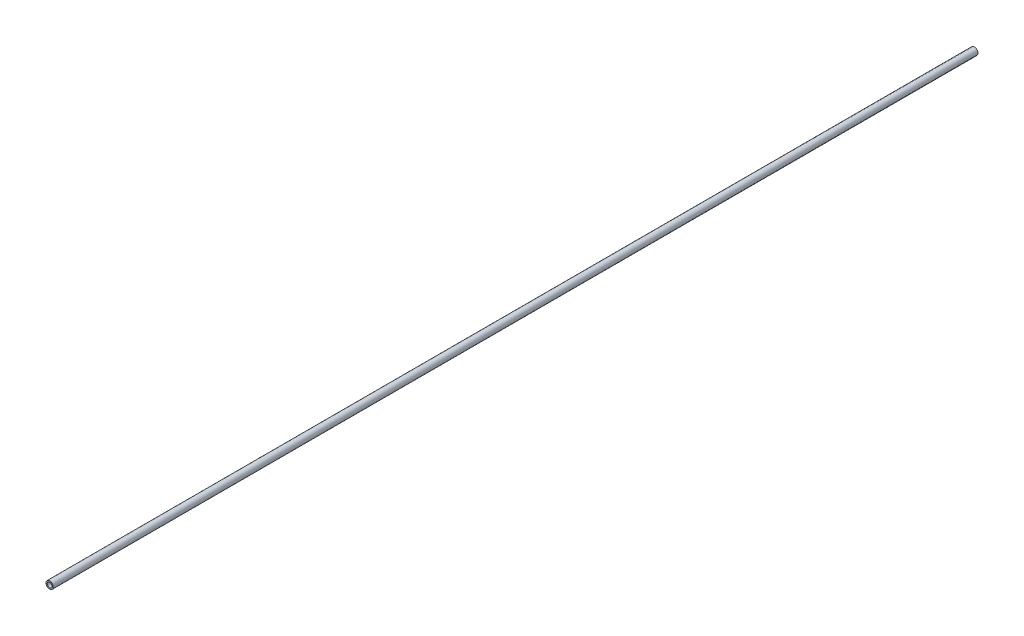
ISO-10303-21;
HEADER;
FILE_DESCRIPTION(('STEP AP214'),'2;1');
FILE_NAME('part.step','',(''),(''),'','','');
FILE_SCHEMA(('AUTOMOTIVE_DESIGN { 1 0 10303 214 1 1 1 1 }'));
ENDSEC;
DATA;
#1=APPLICATION_CONTEXT('core data for automotive mechanical design processes');
#2=APPLICATION_PROTOCOL_DEFINITION('international standard','automotive_design',2000,#1);
#3=PRODUCT_CONTEXT('',#1,'mechanical');
#4=PRODUCT('Part','Part','',(#3));
#5=PRODUCT_RELATED_PRODUCT_CATEGORY('part','',(#4));
#6=PRODUCT_DEFINITION_FORMATION('','',#4);
#7=PRODUCT_DEFINITION_CONTEXT('part definition',#1,'design');
#8=PRODUCT_DEFINITION('design','',#6,#7);
#9=PRODUCT_DEFINITION_SHAPE('','',#8);
#10=(LENGTH_UNIT() NAMED_UNIT(*) SI_UNIT(.MILLI.,.METRE.));
#11=(NAMED_UNIT(*) PLANE_ANGLE_UNIT() SI_UNIT($,.RADIAN.));
#12=(NAMED_UNIT(*) SI_UNIT($,.STERADIAN.) SOLID_ANGLE_UNIT());
#13=UNCERTAINTY_MEASURE_WITH_UNIT(LENGTH_MEASURE(1.E-05),#10,'distance_accuracy_value','');
#14=(GEOMETRIC_REPRESENTATION_CONTEXT(3) GLOBAL_UNCERTAINTY_ASSIGNED_CONTEXT((#13)) GLOBAL_UNIT_ASSIGNED_CONTEXT((#10,
#11,#12)) REPRESENTATION_CONTEXT('',''));
#15=CARTESIAN_POINT('',(0.,0.,0.));
#16=DIRECTION('',(0.,0.,1.));
#17=DIRECTION('',(1.,0.,0.));
#18=AXIS2_PLACEMENT_3D('',#15,#16,#17);
#19=CARTESIAN_POINT('',(0.,0.,1219.2));
#20=DIRECTION('',(0.,0.,1.));
#21=DIRECTION('',(1.,0.,0.));
#22=AXIS2_PLACEMENT_3D('',#19,#20,#21);
#23=PLANE('',#22);
#24=CARTESIAN_POINT('',(0.,0.,1219.2));
#25=DIRECTION('',(0.,0.,1.));
#26=DIRECTION('',(1.,0.,0.));
#27=AXIS2_PLACEMENT_3D('',#24,#25,#26);
#28=CIRCLE('',#27,4.7625);
#29=CARTESIAN_POINT('',(-4.7625,0.,1219.2));
#30=VERTEX_POINT('',#29);
#31=EDGE_CURVE('E10',#30,#30,#28,.T.);
#32=ORIENTED_EDGE('',*,*,#31,.T.);
#33=EDGE_LOOP('',(#32));
#34=FACE_BOUND('',#33,.T.);
#35=CARTESIAN_POINT('',(0.,0.,1219.2));
#36=DIRECTION('',(0.,0.,1.));
#37=DIRECTION('',(1.,0.,0.));
#38=AXIS2_PLACEMENT_3D('',#35,#36,#37);
#39=CIRCLE('',#38,3.175);
#40=CARTESIAN_POINT('',(-3.175,0.,1219.2));
#41=VERTEX_POINT('',#40);
#42=EDGE_CURVE('E48',#41,#41,#39,.T.);
#43=ORIENTED_EDGE('',*,*,#42,.F.);
#44=EDGE_LOOP('',(#43));
#45=FACE_BOUND('',#44,.T.);
#46=ADVANCED_FACE('F37',(#34,#45),#23,.T.);
#47=CARTESIAN_POINT('',(0.,0.,0.));
#48=DIRECTION('',(0.,0.,1.));
#49=DIRECTION('',(1.,0.,0.));
#50=AXIS2_PLACEMENT_3D('',#47,#48,#49);
#51=PLANE('',#50);
#52=CARTESIAN_POINT('',(0.,0.,0.));
#53=DIRECTION('',(0.,0.,1.));
#54=DIRECTION('',(1.,0.,0.));
#55=AXIS2_PLACEMENT_3D('',#52,#53,#54);
#56=CIRCLE('',#55,4.7625);
#57=CARTESIAN_POINT('',(-4.7625,0.,0.));
#58=VERTEX_POINT('',#57);
#59=EDGE_CURVE('E41',#58,#58,#56,.T.);
#60=ORIENTED_EDGE('',*,*,#59,.F.);
#61=EDGE_LOOP('',(#60));
#62=FACE_BOUND('',#61,.T.);
#63=CARTESIAN_POINT('',(0.,0.,0.));
#64=DIRECTION('',(0.,0.,1.));
#65=DIRECTION('',(1.,0.,0.));
#66=AXIS2_PLACEMENT_3D('',#63,#64,#65);
#67=CIRCLE('',#66,3.175);
#68=CARTESIAN_POINT('',(-3.175,0.,0.));
#69=VERTEX_POINT('',#68);
#70=EDGE_CURVE('E50',#69,#69,#67,.T.);
#71=ORIENTED_EDGE('',*,*,#70,.T.);
#72=EDGE_LOOP('',(#71));
#73=FACE_BOUND('',#72,.T.);
#74=ADVANCED_FACE('F60',(#62,#73),#51,.F.);
#75=CARTESIAN_POINT('',(0.,0.,1219.2));
#76=DIRECTION('',(0.,0.,-1.));
#77=DIRECTION('',(-1.,0.,0.));
#78=AXIS2_PLACEMENT_3D('',#75,#76,#77);
#79=CYLINDRICAL_SURFACE('',#78,4.7625);
#80=CARTESIAN_POINT('',(-4.7625,0.,1219.2));
#81=CARTESIAN_POINT('',(-4.7625,0.,1206.5));
#82=CARTESIAN_POINT('',(-4.7625,0.,1193.8));
#83=CARTESIAN_POINT('',(-4.7625,0.,1168.4));
#84=CARTESIAN_POINT('',(-4.7625,0.,1155.7));
#85=CARTESIAN_POINT('',(-4.7625,0.,1130.3));
#86=CARTESIAN_POINT('',(-4.7625,0.,1117.6));
#87=CARTESIAN_POINT('',(-4.7625,0.,1092.2));
#88=CARTESIAN_POINT('',(-4.7625,0.,1079.5));
#89=CARTESIAN_POINT('',(-4.7625,0.,1054.1));
#90=CARTESIAN_POINT('',(-4.7625,0.,1041.4));
#91=CARTESIAN_POINT('',(-4.7625,0.,1016.));
#92=CARTESIAN_POINT('',(-4.7625,0.,1003.3));
#93=CARTESIAN_POINT('',(-4.7625,0.,977.9));
#94=CARTESIAN_POINT('',(-4.7625,0.,965.2));
#95=CARTESIAN_POINT('',(-4.7625,0.,939.8));
#96=CARTESIAN_POINT('',(-4.7625,0.,927.1));
#97=CARTESIAN_POINT('',(-4.7625,0.,901.7));
#98=CARTESIAN_POINT('',(-4.7625,0.,889.));
#99=CARTESIAN_POINT('',(-4.7625,0.,863.6));
#100=CARTESIAN_POINT('',(-4.7625,0.,850.9));
#101=CARTESIAN_POINT('',(-4.7625,0.,825.5));
#102=CARTESIAN_POINT('',(-4.7625,0.,812.8));
#103=CARTESIAN_POINT('',(-4.7625,0.,787.4));
#104=CARTESIAN_POINT('',(-4.7625,0.,774.7));
#105=CARTESIAN_POINT('',(-4.7625,0.,749.3));
#106=CARTESIAN_POINT('',(-4.7625,0.,736.6));
#107=CARTESIAN_POINT('',(-4.7625,0.,711.2));
#108=CARTESIAN_POINT('',(-4.7625,0.,698.5));
#109=CARTESIAN_POINT('',(-4.7625,0.,673.1));
#110=CARTESIAN_POINT('',(-4.7625,0.,660.4));
#111=CARTESIAN_POINT('',(-4.7625,0.,635.));
#112=CARTESIAN_POINT('',(-4.7625,0.,622.3));
#113=CARTESIAN_POINT('',(-4.7625,0.,596.9));
#114=CARTESIAN_POINT('',(-4.7625,0.,584.2));
#115=CARTESIAN_POINT('',(-4.7625,0.,558.8));
#116=CARTESIAN_POINT('',(-4.7625,0.,546.1));
#117=CARTESIAN_POINT('',(-4.7625,0.,520.7));
#118=CARTESIAN_POINT('',(-4.7625,0.,508.));
#119=CARTESIAN_POINT('',(-4.7625,0.,482.6));
#120=CARTESIAN_POINT('',(-4.7625,0.,469.9));
#121=CARTESIAN_POINT('',(-4.7625,0.,444.5));
#122=CARTESIAN_POINT('',(-4.7625,0.,431.8));
#123=CARTESIAN_POINT('',(-4.7625,0.,406.4));
#124=CARTESIAN_POINT('',(-4.7625,0.,393.7));
#125=CARTESIAN_POINT('',(-4.7625,0.,368.3));
#126=CARTESIAN_POINT('',(-4.7625,0.,355.6));
#127=CARTESIAN_POINT('',(-4.7625,0.,330.2));
#128=CARTESIAN_POINT('',(-4.7625,0.,317.5));
#129=CARTESIAN_POINT('',(-4.7625,0.,292.1));
#130=CARTESIAN_POINT('',(-4.7625,0.,279.4));
#131=CARTESIAN_POINT('',(-4.7625,0.,254.));
#132=CARTESIAN_POINT('',(-4.7625,0.,241.3));
#133=CARTESIAN_POINT('',(-4.7625,0.,215.9));
#134=CARTESIAN_POINT('',(-4.7625,0.,203.2));
#135=CARTESIAN_POINT('',(-4.7625,0.,177.8));
#136=CARTESIAN_POINT('',(-4.7625,0.,165.1));
#137=CARTESIAN_POINT('',(-4.7625,0.,139.7));
#138=CARTESIAN_POINT('',(-4.7625,0.,127.));
#139=CARTESIAN_POINT('',(-4.7625,0.,101.6));
#140=CARTESIAN_POINT('',(-4.7625,0.,88.9));
#141=CARTESIAN_POINT('',(-4.7625,0.,63.5));
#142=CARTESIAN_POINT('',(-4.7625,0.,50.8));
#143=CARTESIAN_POINT('',(-4.7625,0.,25.4));
#144=CARTESIAN_POINT('',(-4.7625,0.,12.7));
#145=CARTESIAN_POINT('',(-4.7625,0.,0.));
#146=B_SPLINE_CURVE_WITH_KNOTS('',3,(#80,#81,#82,#83,#84,#85,#86,#87,#88,#89,#90,#91,#92,#93,
#94,#95,#96,#97,#98,#99,#100,#101,#102,#103,#104,#105,#106,#107,#108,#109,#110,#111,#112,#113,
#114,#115,#116,#117,#118,#119,#120,#121,#122,#123,#124,#125,#126,#127,#128,#129,#130,#131,#132,
#133,#134,#135,#136,#137,#138,#139,#140,#141,#142,#143,#144,#145),.UNSPECIFIED.,.F.,.F.,(4,2,2,
2,2,2,2,2,2,2,2,2,2,2,2,2,2,2,2,2,2,2,2,2,2,2,2,2,2,2,2,2,4),(0.,38.1,76.2,114.3,152.4,190.5,
228.6,266.7,304.8,342.9,381.,419.1,457.2,495.3,533.4,571.5,609.6,647.7,685.8,723.9,762.,800.1,
838.2,876.3,914.4,952.5,990.6,1028.7,1066.8,1104.9,1143.,1181.1,1219.2),.UNSPECIFIED.);
#147=EDGE_CURVE('BSEAM39',#30,#58,#146,.T.);
#148=ORIENTED_EDGE('',*,*,#31,.F.);
#149=ORIENTED_EDGE('',*,*,#59,.T.);
#150=ORIENTED_EDGE('',*,*,#147,.T.);
#151=ORIENTED_EDGE('',*,*,#147,.F.);
#152=EDGE_LOOP('',(#148,#150,#149,#151));
#153=FACE_BOUND('',#152,.T.);
#154=ADVANCED_FACE('F39',(#153),#79,.T.);
#155=CARTESIAN_POINT('',(0.,0.,1219.2));
#156=DIRECTION('',(0.,0.,-1.));
#157=DIRECTION('',(-1.,0.,0.));
#158=AXIS2_PLACEMENT_3D('',#155,#156,#157);
#159=CYLINDRICAL_SURFACE('',#158,3.175);
#160=CARTESIAN_POINT('',(-3.175,0.,1219.2));
#161=CARTESIAN_POINT('',(-3.175,0.,1206.5));
#162=CARTESIAN_POINT('',(-3.175,0.,1193.8));
#163=CARTESIAN_POINT('',(-3.175,0.,1168.4));
#164=CARTESIAN_POINT('',(-3.175,0.,1155.7));
#165=CARTESIAN_POINT('',(-3.175,0.,1130.3));
#166=CARTESIAN_POINT('',(-3.175,0.,1117.6));
#167=CARTESIAN_POINT('',(-3.175,0.,1092.2));
#168=CARTESIAN_POINT('',(-3.175,0.,1079.5));
#169=CARTESIAN_POINT('',(-3.175,0.,1054.1));
#170=CARTESIAN_POINT('',(-3.175,0.,1041.4));
#171=CARTESIAN_POINT('',(-3.175,0.,1016.));
#172=CARTESIAN_POINT('',(-3.175,0.,1003.3));
#173=CARTESIAN_POINT('',(-3.175,0.,977.9));
#174=CARTESIAN_POINT('',(-3.175,0.,965.2));
#175=CARTESIAN_POINT('',(-3.175,0.,939.8));
#176=CARTESIAN_POINT('',(-3.175,0.,927.1));
#177=CARTESIAN_POINT('',(-3.175,0.,901.7));
#178=CARTESIAN_POINT('',(-3.175,0.,889.));
#179=CARTESIAN_POINT('',(-3.175,0.,863.6));
#180=CARTESIAN_POINT('',(-3.175,0.,850.9));
#181=CARTESIAN_POINT('',(-3.175,0.,825.5));
#182=CARTESIAN_POINT('',(-3.175,0.,812.8));
#183=CARTESIAN_POINT('',(-3.175,0.,787.4));
#184=CARTESIAN_POINT('',(-3.175,0.,774.7));
#185=CARTESIAN_POINT('',(-3.175,0.,749.3));
#186=CARTESIAN_POINT('',(-3.175,0.,736.6));
#187=CARTESIAN_POINT('',(-3.175,0.,711.2));
#188=CARTESIAN_POINT('',(-3.175,0.,698.5));
#189=CARTESIAN_POINT('',(-3.175,0.,673.1));
#190=CARTESIAN_POINT('',(-3.175,0.,660.4));
#191=CARTESIAN_POINT('',(-3.175,0.,635.));
#192=CARTESIAN_POINT('',(-3.175,0.,622.3));
#193=CARTESIAN_POINT('',(-3.175,0.,596.9));
#194=CARTESIAN_POINT('',(-3.175,0.,584.2));
#195=CARTESIAN_POINT('',(-3.175,0.,558.8));
#196=CARTESIAN_POINT('',(-3.175,0.,546.1));
#197=CARTESIAN_POINT('',(-3.175,0.,520.7));
#198=CARTESIAN_POINT('',(-3.175,0.,508.));
#199=CARTESIAN_POINT('',(-3.175,0.,482.6));
#200=CARTESIAN_POINT('',(-3.175,0.,469.9));
#201=CARTESIAN_POINT('',(-3.175,0.,444.5));
#202=CARTESIAN_POINT('',(-3.175,0.,431.8));
#203=CARTESIAN_POINT('',(-3.175,0.,406.4));
#204=CARTESIAN_POINT('',(-3.175,0.,393.7));
#205=CARTESIAN_POINT('',(-3.175,0.,368.3));
#206=CARTESIAN_POINT('',(-3.175,0.,355.6));
#207=CARTESIAN_POINT('',(-3.175,0.,330.2));
#208=CARTESIAN_POINT('',(-3.175,0.,317.5));
#209=CARTESIAN_POINT('',(-3.175,0.,292.1));
#210=CARTESIAN_POINT('',(-3.175,0.,279.4));
#211=CARTESIAN_POINT('',(-3.175,0.,254.));
#212=CARTESIAN_POINT('',(-3.175,0.,241.3));
#213=CARTESIAN_POINT('',(-3.175,0.,215.9));
#214=CARTESIAN_POINT('',(-3.175,0.,203.2));
#215=CARTESIAN_POINT('',(-3.175,0.,177.8));
#216=CARTESIAN_POINT('',(-3.175,0.,165.1));
#217=CARTESIAN_POINT('',(-3.175,0.,139.7));
#218=CARTESIAN_POINT('',(-3.175,0.,127.));
#219=CARTESIAN_POINT('',(-3.175,0.,101.6));
#220=CARTESIAN_POINT('',(-3.175,0.,88.9));
#221=CARTESIAN_POINT('',(-3.175,0.,63.5));
#222=CARTESIAN_POINT('',(-3.175,0.,50.8));
#223=CARTESIAN_POINT('',(-3.175,0.,25.4));
#224=CARTESIAN_POINT('',(-3.175,0.,12.7));
#225=CARTESIAN_POINT('',(-3.175,0.,0.));
#226=B_SPLINE_CURVE_WITH_KNOTS('',3,(#160,#161,#162,#163,#164,#165,#166,#167,#168,#169,#170,
#171,#172,#173,#174,#175,#176,#177,#178,#179,#180,#181,#182,#183,#184,#185,#186,#187,#188,#189,
#190,#191,#192,#193,#194,#195,#196,#197,#198,#199,#200,#201,#202,#203,#204,#205,#206,#207,#208,
#209,#210,#211,#212,#213,#214,#215,#216,#217,#218,#219,#220,#221,#222,#223,#224,#225),
.UNSPECIFIED.,.F.,.F.,(4,2,2,2,2,2,2,2,2,2,2,2,2,2,2,2,2,2,2,2,2,2,2,2,2,2,2,2,2,2,2,2,4),(0.,
38.1,76.2,114.3,152.4,190.5,228.6,266.7,304.8,342.9,381.,419.1,457.2,495.3,533.4,571.5,609.6,
647.7,685.8,723.9,762.,800.1,838.2,876.3,914.4,952.5,990.6,1028.7,1066.8,1104.9,1143.,1181.1,
1219.2),.UNSPECIFIED.);
#227=EDGE_CURVE('BSEAM56',#41,#69,#226,.T.);
#228=ORIENTED_EDGE('',*,*,#42,.T.);
#229=ORIENTED_EDGE('',*,*,#70,.F.);
#230=ORIENTED_EDGE('',*,*,#227,.T.);
#231=ORIENTED_EDGE('',*,*,#227,.F.);
#232=EDGE_LOOP('',(#228,#230,#229,#231));
#233=FACE_BOUND('',#232,.T.);
#234=ADVANCED_FACE('F56',(#233),#159,.F.);
#235=CLOSED_SHELL('',(#46,#74,#154,#234));
#236=MANIFOLD_SOLID_BREP('B2',#235);
#237=ADVANCED_BREP_SHAPE_REPRESENTATION('',(#18,#236),#14);
#238=SHAPE_DEFINITION_REPRESENTATION(#9,#237);
ENDSEC;
END-ISO-10303-21;
